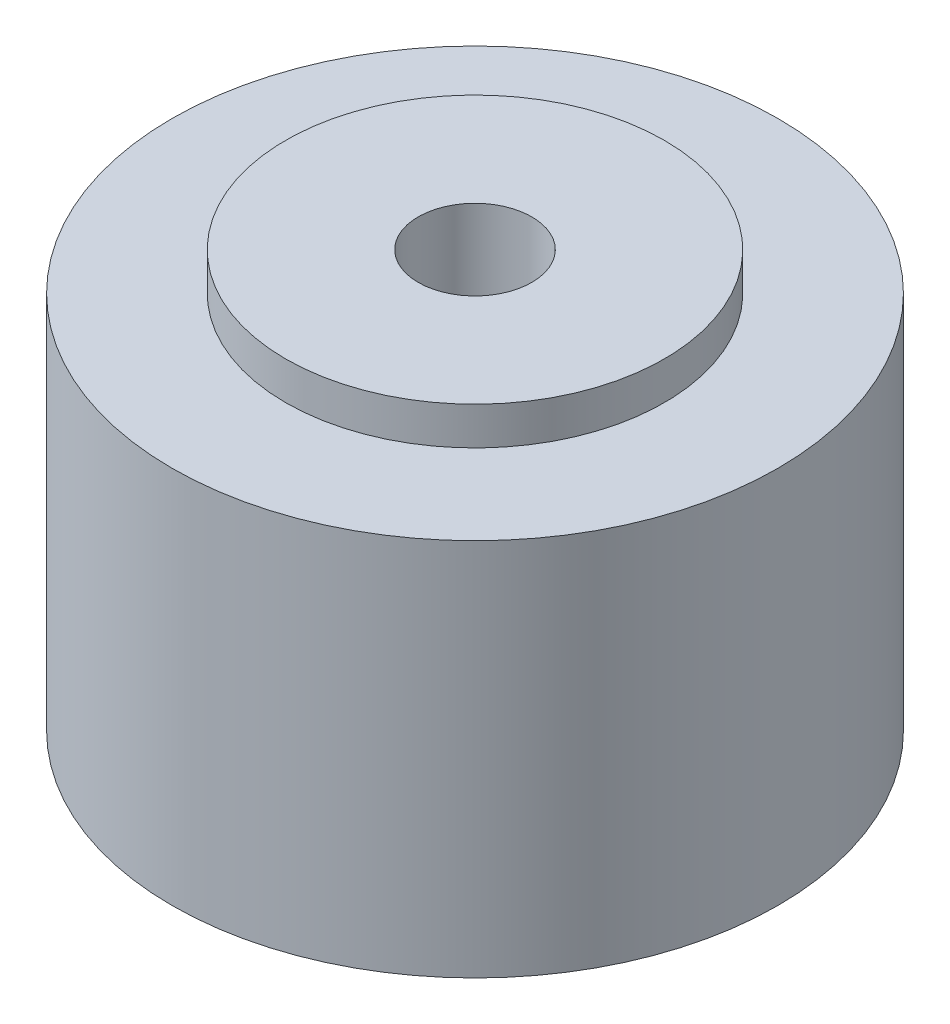
ISO-10303-21;
HEADER;
FILE_DESCRIPTION(('STEP AP214'),'2;1');
FILE_NAME('part.step','',(''),(''),'','','');
FILE_SCHEMA(('AUTOMOTIVE_DESIGN { 1 0 10303 214 1 1 1 1 }'));
ENDSEC;
DATA;
#1=APPLICATION_CONTEXT('core data for automotive mechanical design processes');
#2=APPLICATION_PROTOCOL_DEFINITION('international standard','automotive_design',2000,#1);
#3=PRODUCT_CONTEXT('',#1,'mechanical');
#4=PRODUCT('Part','Part','',(#3));
#5=PRODUCT_RELATED_PRODUCT_CATEGORY('part','',(#4));
#6=PRODUCT_DEFINITION_FORMATION('','',#4);
#7=PRODUCT_DEFINITION_CONTEXT('part definition',#1,'design');
#8=PRODUCT_DEFINITION('design','',#6,#7);
#9=PRODUCT_DEFINITION_SHAPE('','',#8);
#10=(LENGTH_UNIT() NAMED_UNIT(*) SI_UNIT(.MILLI.,.METRE.));
#11=(NAMED_UNIT(*) PLANE_ANGLE_UNIT() SI_UNIT($,.RADIAN.));
#12=(NAMED_UNIT(*) SI_UNIT($,.STERADIAN.) SOLID_ANGLE_UNIT());
#13=UNCERTAINTY_MEASURE_WITH_UNIT(LENGTH_MEASURE(1.E-05),#10,'distance_accuracy_value','');
#14=(GEOMETRIC_REPRESENTATION_CONTEXT(3) GLOBAL_UNCERTAINTY_ASSIGNED_CONTEXT((#13)) GLOBAL_UNIT_ASSIGNED_CONTEXT((#10,
#11,#12)) REPRESENTATION_CONTEXT('',''));
#15=CARTESIAN_POINT('',(0.,0.,0.));
#16=DIRECTION('',(0.,0.,1.));
#17=DIRECTION('',(1.,0.,0.));
#18=AXIS2_PLACEMENT_3D('',#15,#16,#17);
#19=CARTESIAN_POINT('',(0.,3.,0.));
#20=DIRECTION('',(0.,-1.,0.));
#21=DIRECTION('',(0.,0.,-1.));
#22=AXIS2_PLACEMENT_3D('',#19,#20,#21);
#23=CYLINDRICAL_SURFACE('',#22,2.5);
#24=CARTESIAN_POINT('',(0.,-3.,0.));
#25=DIRECTION('',(0.,1.,0.));
#26=DIRECTION('',(0.,0.,1.));
#27=AXIS2_PLACEMENT_3D('',#24,#25,#26);
#28=CIRCLE('',#27,2.5);
#29=CARTESIAN_POINT('',(0.,-3.,2.5));
#30=VERTEX_POINT('',#29);
#31=EDGE_CURVE('E50',#30,#30,#28,.T.);
#32=ORIENTED_EDGE('',*,*,#31,.T.);
#33=EDGE_LOOP('',(#32));
#34=FACE_BOUND('',#33,.T.);
#35=CARTESIAN_POINT('',(0.,-2.5,0.));
#36=DIRECTION('',(0.,1.,0.));
#37=DIRECTION('',(0.,0.,1.));
#38=AXIS2_PLACEMENT_3D('',#35,#36,#37);
#39=CIRCLE('',#38,2.5);
#40=CARTESIAN_POINT('',(0.,-2.5,2.5));
#41=VERTEX_POINT('',#40);
#42=EDGE_CURVE('E10',#41,#41,#39,.T.);
#43=ORIENTED_EDGE('',*,*,#42,.F.);
#44=EDGE_LOOP('',(#43));
#45=FACE_BOUND('',#44,.T.);
#46=ADVANCED_FACE('F37',(#34,#45),#23,.T.);
#47=CARTESIAN_POINT('',(0.,3.,0.));
#48=DIRECTION('',(0.,1.,0.));
#49=DIRECTION('',(0.,0.,1.));
#50=AXIS2_PLACEMENT_3D('',#47,#48,#49);
#51=PLANE('',#50);
#52=CARTESIAN_POINT('',(0.,3.,0.));
#53=DIRECTION('',(0.,1.,0.));
#54=DIRECTION('',(0.,0.,1.));
#55=AXIS2_PLACEMENT_3D('',#52,#53,#54);
#56=CIRCLE('',#55,2.5);
#57=CARTESIAN_POINT('',(0.,3.,2.5));
#58=VERTEX_POINT('',#57);
#59=EDGE_CURVE('E45',#58,#58,#56,.T.);
#60=ORIENTED_EDGE('',*,*,#59,.T.);
#61=EDGE_LOOP('',(#60));
#62=FACE_BOUND('',#61,.T.);
#63=CARTESIAN_POINT('',(0.,3.,0.));
#64=DIRECTION('',(0.,1.,0.));
#65=DIRECTION('',(0.,0.,1.));
#66=AXIS2_PLACEMENT_3D('',#63,#64,#65);
#67=CIRCLE('',#66,0.75);
#68=CARTESIAN_POINT('',(0.,3.,0.75));
#69=VERTEX_POINT('',#68);
#70=EDGE_CURVE('E56',#69,#69,#67,.T.);
#71=ORIENTED_EDGE('',*,*,#70,.F.);
#72=EDGE_LOOP('',(#71));
#73=FACE_BOUND('',#72,.T.);
#74=ADVANCED_FACE('F96',(#62,#73),#51,.T.);
#75=CARTESIAN_POINT('',(0.,-3.,0.));
#76=DIRECTION('',(0.,1.,0.));
#77=DIRECTION('',(0.,0.,1.));
#78=AXIS2_PLACEMENT_3D('',#75,#76,#77);
#79=PLANE('',#78);
#80=ORIENTED_EDGE('',*,*,#31,.F.);
#81=EDGE_LOOP('',(#80));
#82=FACE_BOUND('',#81,.T.);
#83=CARTESIAN_POINT('',(0.,-3.,0.));
#84=DIRECTION('',(0.,1.,0.));
#85=DIRECTION('',(0.,0.,1.));
#86=AXIS2_PLACEMENT_3D('',#83,#84,#85);
#87=CIRCLE('',#86,0.75);
#88=CARTESIAN_POINT('',(0.,-3.,0.75));
#89=VERTEX_POINT('',#88);
#90=EDGE_CURVE('E58',#89,#89,#87,.T.);
#91=ORIENTED_EDGE('',*,*,#90,.T.);
#92=EDGE_LOOP('',(#91));
#93=FACE_BOUND('',#92,.T.);
#94=ADVANCED_FACE('F101',(#82,#93),#79,.F.);
#95=CARTESIAN_POINT('',(0.,2.5,0.));
#96=DIRECTION('',(0.,1.,0.));
#97=DIRECTION('',(0.,0.,1.));
#98=AXIS2_PLACEMENT_3D('',#95,#96,#97);
#99=CIRCLE('',#98,2.5);
#100=CARTESIAN_POINT('',(0.,2.5,2.5));
#101=VERTEX_POINT('',#100);
#102=EDGE_CURVE('E70',#101,#101,#99,.T.);
#103=ORIENTED_EDGE('',*,*,#102,.T.);
#104=EDGE_LOOP('',(#103));
#105=FACE_BOUND('',#104,.T.);
#106=ORIENTED_EDGE('',*,*,#59,.F.);
#107=EDGE_LOOP('',(#106));
#108=FACE_BOUND('',#107,.T.);
#109=ADVANCED_FACE('F39',(#105,#108),#23,.T.);
#110=CARTESIAN_POINT('',(0.,3.,0.));
#111=DIRECTION('',(0.,-1.,0.));
#112=DIRECTION('',(0.,0.,-1.));
#113=AXIS2_PLACEMENT_3D('',#110,#111,#112);
#114=CYLINDRICAL_SURFACE('',#113,0.75);
#115=ORIENTED_EDGE('',*,*,#70,.T.);
#116=EDGE_LOOP('',(#115));
#117=FACE_BOUND('',#116,.T.);
#118=ORIENTED_EDGE('',*,*,#90,.F.);
#119=EDGE_LOOP('',(#118));
#120=FACE_BOUND('',#119,.T.);
#121=ADVANCED_FACE('F83',(#117,#120),#114,.F.);
#122=CARTESIAN_POINT('',(0.,2.5,0.));
#123=DIRECTION('',(0.,1.,0.));
#124=DIRECTION('',(0.,0.,1.));
#125=AXIS2_PLACEMENT_3D('',#122,#123,#124);
#126=PLANE('',#125);
#127=CARTESIAN_POINT('',(0.,2.5,0.));
#128=DIRECTION('',(0.,1.,0.));
#129=DIRECTION('',(0.,0.,1.));
#130=AXIS2_PLACEMENT_3D('',#127,#128,#129);
#131=CIRCLE('',#130,4.);
#132=CARTESIAN_POINT('',(0.,2.5,4.));
#133=VERTEX_POINT('',#132);
#134=EDGE_CURVE('E62',#133,#133,#131,.T.);
#135=ORIENTED_EDGE('',*,*,#134,.T.);
#136=EDGE_LOOP('',(#135));
#137=FACE_BOUND('',#136,.T.);
#138=ORIENTED_EDGE('',*,*,#102,.F.);
#139=EDGE_LOOP('',(#138));
#140=FACE_BOUND('',#139,.T.);
#141=ADVANCED_FACE('F80',(#137,#140),#126,.T.);
#142=CARTESIAN_POINT('',(0.,-2.5,0.));
#143=DIRECTION('',(0.,1.,0.));
#144=DIRECTION('',(0.,0.,1.));
#145=AXIS2_PLACEMENT_3D('',#142,#143,#144);
#146=PLANE('',#145);
#147=CARTESIAN_POINT('',(0.,-2.5,0.));
#148=DIRECTION('',(0.,1.,0.));
#149=DIRECTION('',(0.,0.,1.));
#150=AXIS2_PLACEMENT_3D('',#147,#148,#149);
#151=CIRCLE('',#150,4.);
#152=CARTESIAN_POINT('',(0.,-2.5,4.));
#153=VERTEX_POINT('',#152);
#154=EDGE_CURVE('E66',#153,#153,#151,.T.);
#155=ORIENTED_EDGE('',*,*,#154,.F.);
#156=EDGE_LOOP('',(#155));
#157=FACE_BOUND('',#156,.T.);
#158=ORIENTED_EDGE('',*,*,#42,.T.);
#159=EDGE_LOOP('',(#158));
#160=FACE_BOUND('',#159,.T.);
#161=ADVANCED_FACE('F82',(#157,#160),#146,.F.);
#162=CARTESIAN_POINT('',(0.,2.5,0.));
#163=DIRECTION('',(0.,-1.,0.));
#164=DIRECTION('',(0.,0.,-1.));
#165=AXIS2_PLACEMENT_3D('',#162,#163,#164);
#166=CYLINDRICAL_SURFACE('',#165,4.);
#167=ORIENTED_EDGE('',*,*,#134,.F.);
#168=EDGE_LOOP('',(#167));
#169=FACE_BOUND('',#168,.T.);
#170=ORIENTED_EDGE('',*,*,#154,.T.);
#171=EDGE_LOOP('',(#170));
#172=FACE_BOUND('',#171,.T.);
#173=ADVANCED_FACE('F90',(#169,#172),#166,.T.);
#174=CLOSED_SHELL('',(#46,#74,#94,#109,#121,#141,#161,#173));
#175=MANIFOLD_SOLID_BREP('B2',#174);
#176=ADVANCED_BREP_SHAPE_REPRESENTATION('',(#18,#175),#14);
#177=SHAPE_DEFINITION_REPRESENTATION(#9,#176);
ENDSEC;
END-ISO-10303-21;
